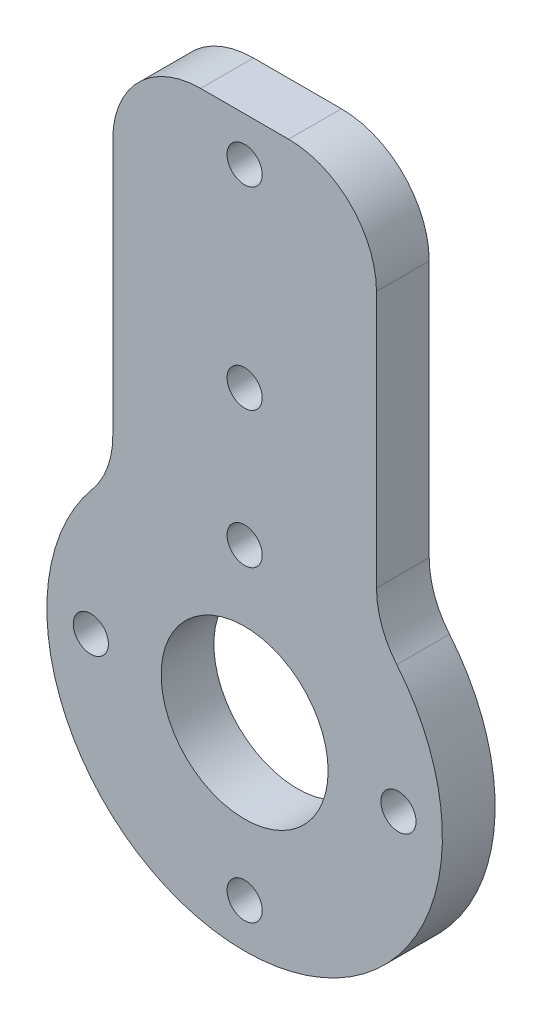
ISO-10303-21;
HEADER;
FILE_DESCRIPTION(('STEP AP214'),'2;1');
FILE_NAME('part.step','',(''),(''),'','','');
FILE_SCHEMA(('AUTOMOTIVE_DESIGN { 1 0 10303 214 1 1 1 1 }'));
ENDSEC;
DATA;
#1=APPLICATION_CONTEXT('core data for automotive mechanical design processes');
#2=APPLICATION_PROTOCOL_DEFINITION('international standard','automotive_design',2000,#1);
#3=PRODUCT_CONTEXT('',#1,'mechanical');
#4=PRODUCT('Part','Part','',(#3));
#5=PRODUCT_RELATED_PRODUCT_CATEGORY('part','',(#4));
#6=PRODUCT_DEFINITION_FORMATION('','',#4);
#7=PRODUCT_DEFINITION_CONTEXT('part definition',#1,'design');
#8=PRODUCT_DEFINITION('design','',#6,#7);
#9=PRODUCT_DEFINITION_SHAPE('','',#8);
#10=(LENGTH_UNIT() NAMED_UNIT(*) SI_UNIT(.MILLI.,.METRE.));
#11=(NAMED_UNIT(*) PLANE_ANGLE_UNIT() SI_UNIT($,.RADIAN.));
#12=(NAMED_UNIT(*) SI_UNIT($,.STERADIAN.) SOLID_ANGLE_UNIT());
#13=UNCERTAINTY_MEASURE_WITH_UNIT(LENGTH_MEASURE(1.E-05),#10,'distance_accuracy_value','');
#14=(GEOMETRIC_REPRESENTATION_CONTEXT(3) GLOBAL_UNCERTAINTY_ASSIGNED_CONTEXT((#13)) GLOBAL_UNIT_ASSIGNED_CONTEXT((#10,
#11,#12)) REPRESENTATION_CONTEXT('',''));
#15=CARTESIAN_POINT('',(0.,0.,0.));
#16=DIRECTION('',(0.,0.,1.));
#17=DIRECTION('',(1.,0.,0.));
#18=AXIS2_PLACEMENT_3D('',#15,#16,#17);
#19=CARTESIAN_POINT('',(-15.,0.,3.));
#20=DIRECTION('',(1.,0.,0.));
#21=DIRECTION('',(0.,1.,0.));
#22=AXIS2_PLACEMENT_3D('',#19,#20,#21);
#23=PLANE('',#22);
#24=DIRECTION('',(0.,-1.,0.));
#25=VECTOR('',#24,1.);
#26=CARTESIAN_POINT('',(-15.,0.,3.));
#27=LINE('',#26,#25);
#28=CARTESIAN_POINT('',(-15.,50.,3.));
#29=VERTEX_POINT('',#28);
#30=CARTESIAN_POINT('',(-15.,20.7665596572952,3.));
#31=VERTEX_POINT('',#30);
#32=EDGE_CURVE('E199',#29,#31,#27,.T.);
#33=ORIENTED_EDGE('',*,*,#32,.F.);
#34=DIRECTION('',(0.,0.,-1.));
#35=VECTOR('',#34,1.);
#36=CARTESIAN_POINT('',(-15.,50.,-3.));
#37=LINE('',#36,#35);
#38=CARTESIAN_POINT('',(-15.,50.,-3.));
#39=VERTEX_POINT('',#38);
#40=EDGE_CURVE('E169',#29,#39,#37,.T.);
#41=ORIENTED_EDGE('',*,*,#40,.T.);
#42=DIRECTION('',(0.,-1.,0.));
#43=VECTOR('',#42,1.);
#44=CARTESIAN_POINT('',(-15.,0.,-3.));
#45=LINE('',#44,#43);
#46=CARTESIAN_POINT('',(-15.,20.7665596572952,-3.));
#47=VERTEX_POINT('',#46);
#48=EDGE_CURVE('E116',#39,#47,#45,.T.);
#49=ORIENTED_EDGE('',*,*,#48,.T.);
#50=DIRECTION('',(0.,0.,1.));
#51=VECTOR('',#50,1.);
#52=CARTESIAN_POINT('',(-15.,20.7665596572952,3.));
#53=LINE('',#52,#51);
#54=EDGE_CURVE('E166',#47,#31,#53,.T.);
#55=ORIENTED_EDGE('',*,*,#54,.T.);
#56=EDGE_LOOP('',(#33,#41,#49,#55));
#57=FACE_BOUND('',#56,.T.);
#58=ADVANCED_FACE('F44',(#57),#23,.F.);
#59=CARTESIAN_POINT('',(0.,0.,3.));
#60=DIRECTION('',(0.,0.,-1.));
#61=DIRECTION('',(-1.,0.,0.));
#62=AXIS2_PLACEMENT_3D('',#59,#60,#61);
#63=CYLINDRICAL_SURFACE('',#62,22.5);
#64=CARTESIAN_POINT('',(0.,0.,-3.));
#65=DIRECTION('',(0.,0.,1.));
#66=DIRECTION('',(1.,0.,0.));
#67=AXIS2_PLACEMENT_3D('',#64,#65,#66);
#68=CIRCLE('',#67,22.5);
#69=CARTESIAN_POINT('',(-17.3076923076923,14.3768489935121,-3.));
#70=VERTEX_POINT('',#69);
#71=CARTESIAN_POINT('',(17.3076923076923,14.3768489935121,-3.));
#72=VERTEX_POINT('',#71);
#73=EDGE_CURVE('E185',#70,#72,#68,.T.);
#74=ORIENTED_EDGE('',*,*,#73,.T.);
#75=DIRECTION('',(0.,0.,-1.));
#76=VECTOR('',#75,1.);
#77=CARTESIAN_POINT('',(17.3076923076923,14.3768489935121,3.));
#78=LINE('',#77,#76);
#79=CARTESIAN_POINT('',(17.3076923076923,14.3768489935121,3.));
#80=VERTEX_POINT('',#79);
#81=EDGE_CURVE('E60',#72,#80,#78,.F.);
#82=ORIENTED_EDGE('',*,*,#81,.T.);
#83=CARTESIAN_POINT('',(0.,0.,3.));
#84=DIRECTION('',(0.,0.,1.));
#85=DIRECTION('',(1.,0.,0.));
#86=AXIS2_PLACEMENT_3D('',#83,#84,#85);
#87=CIRCLE('',#86,22.5);
#88=CARTESIAN_POINT('',(-17.3076923076923,14.3768489935121,3.));
#89=VERTEX_POINT('',#88);
#90=EDGE_CURVE('E195',#89,#80,#87,.T.);
#91=ORIENTED_EDGE('',*,*,#90,.F.);
#92=DIRECTION('',(0.,0.,-1.));
#93=VECTOR('',#92,1.);
#94=CARTESIAN_POINT('',(-17.3076923076923,14.3768489935121,3.));
#95=LINE('',#94,#93);
#96=EDGE_CURVE('E172',#89,#70,#95,.T.);
#97=ORIENTED_EDGE('',*,*,#96,.T.);
#98=EDGE_LOOP('',(#74,#82,#91,#97));
#99=FACE_BOUND('',#98,.T.);
#100=ADVANCED_FACE('F194',(#99),#63,.T.);
#101=CARTESIAN_POINT('',(15.,0.,3.));
#102=DIRECTION('',(1.,0.,0.));
#103=DIRECTION('',(0.,1.,0.));
#104=AXIS2_PLACEMENT_3D('',#101,#102,#103);
#105=PLANE('',#104);
#106=DIRECTION('',(0.,-1.,0.));
#107=VECTOR('',#106,1.);
#108=CARTESIAN_POINT('',(15.,0.,-3.));
#109=LINE('',#108,#107);
#110=CARTESIAN_POINT('',(15.,50.,-3.));
#111=VERTEX_POINT('',#110);
#112=CARTESIAN_POINT('',(15.,20.7665596572952,-3.));
#113=VERTEX_POINT('',#112);
#114=EDGE_CURVE('E134',#111,#113,#109,.T.);
#115=ORIENTED_EDGE('',*,*,#114,.F.);
#116=DIRECTION('',(0.,0.,-1.));
#117=VECTOR('',#116,1.);
#118=CARTESIAN_POINT('',(15.,50.,3.));
#119=LINE('',#118,#117);
#120=CARTESIAN_POINT('',(15.,50.,3.));
#121=VERTEX_POINT('',#120);
#122=EDGE_CURVE('E158',#111,#121,#119,.F.);
#123=ORIENTED_EDGE('',*,*,#122,.T.);
#124=DIRECTION('',(0.,-1.,0.));
#125=VECTOR('',#124,1.);
#126=CARTESIAN_POINT('',(15.,0.,3.));
#127=LINE('',#126,#125);
#128=CARTESIAN_POINT('',(15.,20.7665596572952,3.));
#129=VERTEX_POINT('',#128);
#130=EDGE_CURVE('E198',#121,#129,#127,.T.);
#131=ORIENTED_EDGE('',*,*,#130,.T.);
#132=DIRECTION('',(0.,0.,-1.));
#133=VECTOR('',#132,1.);
#134=CARTESIAN_POINT('',(15.,20.7665596572952,3.));
#135=LINE('',#134,#133);
#136=EDGE_CURVE('E154',#129,#113,#135,.T.);
#137=ORIENTED_EDGE('',*,*,#136,.T.);
#138=EDGE_LOOP('',(#115,#123,#131,#137));
#139=FACE_BOUND('',#138,.T.);
#140=ADVANCED_FACE('F304',(#139),#105,.T.);
#141=CARTESIAN_POINT('',(0.,17.5,3.));
#142=DIRECTION('',(0.,0.,-1.));
#143=DIRECTION('',(-1.,0.,0.));
#144=AXIS2_PLACEMENT_3D('',#141,#142,#143);
#145=CYLINDRICAL_SURFACE('',#144,2.);
#146=CARTESIAN_POINT('',(0.,17.5,3.));
#147=DIRECTION('',(0.,0.,1.));
#148=DIRECTION('',(1.,0.,0.));
#149=AXIS2_PLACEMENT_3D('',#146,#147,#148);
#150=CIRCLE('',#149,2.);
#151=CARTESIAN_POINT('',(2.,17.5,3.));
#152=VERTEX_POINT('',#151);
#153=EDGE_CURVE('E146',#152,#152,#150,.T.);
#154=ORIENTED_EDGE('',*,*,#153,.T.);
#155=EDGE_LOOP('',(#154));
#156=FACE_BOUND('',#155,.T.);
#157=CARTESIAN_POINT('',(0.,17.5,-3.));
#158=DIRECTION('',(0.,0.,1.));
#159=DIRECTION('',(1.,0.,0.));
#160=AXIS2_PLACEMENT_3D('',#157,#158,#159);
#161=CIRCLE('',#160,2.);
#162=CARTESIAN_POINT('',(2.,17.5,-3.));
#163=VERTEX_POINT('',#162);
#164=EDGE_CURVE('E249',#163,#163,#161,.T.);
#165=ORIENTED_EDGE('',*,*,#164,.F.);
#166=EDGE_LOOP('',(#165));
#167=FACE_BOUND('',#166,.T.);
#168=ADVANCED_FACE('F326',(#156,#167),#145,.F.);
#169=CARTESIAN_POINT('',(17.5,0.,3.));
#170=DIRECTION('',(0.,0.,-1.));
#171=DIRECTION('',(-1.,0.,0.));
#172=AXIS2_PLACEMENT_3D('',#169,#170,#171);
#173=CYLINDRICAL_SURFACE('',#172,2.);
#174=CARTESIAN_POINT('',(17.5,0.,3.));
#175=DIRECTION('',(0.,0.,1.));
#176=DIRECTION('',(1.,0.,0.));
#177=AXIS2_PLACEMENT_3D('',#174,#175,#176);
#178=CIRCLE('',#177,2.);
#179=CARTESIAN_POINT('',(19.5,0.,3.));
#180=VERTEX_POINT('',#179);
#181=EDGE_CURVE('E220',#180,#180,#178,.T.);
#182=ORIENTED_EDGE('',*,*,#181,.T.);
#183=EDGE_LOOP('',(#182));
#184=FACE_BOUND('',#183,.T.);
#185=CARTESIAN_POINT('',(17.5,0.,-3.));
#186=DIRECTION('',(0.,0.,1.));
#187=DIRECTION('',(1.,0.,0.));
#188=AXIS2_PLACEMENT_3D('',#185,#186,#187);
#189=CIRCLE('',#188,2.);
#190=CARTESIAN_POINT('',(19.5,0.,-3.));
#191=VERTEX_POINT('',#190);
#192=EDGE_CURVE('E246',#191,#191,#189,.T.);
#193=ORIENTED_EDGE('',*,*,#192,.F.);
#194=EDGE_LOOP('',(#193));
#195=FACE_BOUND('',#194,.T.);
#196=ADVANCED_FACE('F330',(#184,#195),#173,.F.);
#197=CARTESIAN_POINT('',(0.,-17.5,3.));
#198=DIRECTION('',(0.,0.,-1.));
#199=DIRECTION('',(-1.,0.,0.));
#200=AXIS2_PLACEMENT_3D('',#197,#198,#199);
#201=CYLINDRICAL_SURFACE('',#200,2.);
#202=CARTESIAN_POINT('',(0.,-17.5,3.));
#203=DIRECTION('',(0.,0.,1.));
#204=DIRECTION('',(1.,0.,0.));
#205=AXIS2_PLACEMENT_3D('',#202,#203,#204);
#206=CIRCLE('',#205,2.);
#207=CARTESIAN_POINT('',(2.,-17.5,3.));
#208=VERTEX_POINT('',#207);
#209=EDGE_CURVE('E216',#208,#208,#206,.T.);
#210=ORIENTED_EDGE('',*,*,#209,.T.);
#211=EDGE_LOOP('',(#210));
#212=FACE_BOUND('',#211,.T.);
#213=CARTESIAN_POINT('',(0.,-17.5,-3.));
#214=DIRECTION('',(0.,0.,1.));
#215=DIRECTION('',(1.,0.,0.));
#216=AXIS2_PLACEMENT_3D('',#213,#214,#215);
#217=CIRCLE('',#216,2.);
#218=CARTESIAN_POINT('',(2.,-17.5,-3.));
#219=VERTEX_POINT('',#218);
#220=EDGE_CURVE('E242',#219,#219,#217,.T.);
#221=ORIENTED_EDGE('',*,*,#220,.F.);
#222=EDGE_LOOP('',(#221));
#223=FACE_BOUND('',#222,.T.);
#224=ADVANCED_FACE('F338',(#212,#223),#201,.F.);
#225=CARTESIAN_POINT('',(-17.5,0.,3.));
#226=DIRECTION('',(0.,0.,-1.));
#227=DIRECTION('',(-1.,0.,0.));
#228=AXIS2_PLACEMENT_3D('',#225,#226,#227);
#229=CYLINDRICAL_SURFACE('',#228,2.);
#230=CARTESIAN_POINT('',(-17.5,0.,3.));
#231=DIRECTION('',(0.,0.,1.));
#232=DIRECTION('',(1.,0.,0.));
#233=AXIS2_PLACEMENT_3D('',#230,#231,#232);
#234=CIRCLE('',#233,2.);
#235=CARTESIAN_POINT('',(-15.5,0.,3.));
#236=VERTEX_POINT('',#235);
#237=EDGE_CURVE('E212',#236,#236,#234,.T.);
#238=ORIENTED_EDGE('',*,*,#237,.T.);
#239=EDGE_LOOP('',(#238));
#240=FACE_BOUND('',#239,.T.);
#241=CARTESIAN_POINT('',(-17.5,0.,-3.));
#242=DIRECTION('',(0.,0.,1.));
#243=DIRECTION('',(1.,0.,0.));
#244=AXIS2_PLACEMENT_3D('',#241,#242,#243);
#245=CIRCLE('',#244,2.);
#246=CARTESIAN_POINT('',(-15.5,0.,-3.));
#247=VERTEX_POINT('',#246);
#248=EDGE_CURVE('E133',#247,#247,#245,.T.);
#249=ORIENTED_EDGE('',*,*,#248,.F.);
#250=EDGE_LOOP('',(#249));
#251=FACE_BOUND('',#250,.T.);
#252=ADVANCED_FACE('F335',(#240,#251),#229,.F.);
#253=CARTESIAN_POINT('',(0.,60.,3.));
#254=DIRECTION('',(0.,1.,0.));
#255=DIRECTION('',(0.,0.,1.));
#256=AXIS2_PLACEMENT_3D('',#253,#254,#255);
#257=PLANE('',#256);
#258=DIRECTION('',(1.,0.,0.));
#259=VECTOR('',#258,1.);
#260=CARTESIAN_POINT('',(0.,60.,3.));
#261=LINE('',#260,#259);
#262=CARTESIAN_POINT('',(-5.,60.,3.));
#263=VERTEX_POINT('',#262);
#264=CARTESIAN_POINT('',(5.,60.,3.));
#265=VERTEX_POINT('',#264);
#266=EDGE_CURVE('E204',#263,#265,#261,.T.);
#267=ORIENTED_EDGE('',*,*,#266,.T.);
#268=DIRECTION('',(0.,0.,-1.));
#269=VECTOR('',#268,1.);
#270=CARTESIAN_POINT('',(5.,60.,3.));
#271=LINE('',#270,#269);
#272=CARTESIAN_POINT('',(5.,60.,-3.));
#273=VERTEX_POINT('',#272);
#274=EDGE_CURVE('E123',#265,#273,#271,.T.);
#275=ORIENTED_EDGE('',*,*,#274,.T.);
#276=DIRECTION('',(1.,0.,0.));
#277=VECTOR('',#276,1.);
#278=CARTESIAN_POINT('',(0.,60.,-3.));
#279=LINE('',#278,#277);
#280=CARTESIAN_POINT('',(-5.,60.,-3.));
#281=VERTEX_POINT('',#280);
#282=EDGE_CURVE('E114',#281,#273,#279,.T.);
#283=ORIENTED_EDGE('',*,*,#282,.F.);
#284=DIRECTION('',(0.,0.,-1.));
#285=VECTOR('',#284,1.);
#286=CARTESIAN_POINT('',(-5.,60.,3.));
#287=LINE('',#286,#285);
#288=EDGE_CURVE('E129',#281,#263,#287,.F.);
#289=ORIENTED_EDGE('',*,*,#288,.T.);
#290=EDGE_LOOP('',(#267,#275,#283,#289));
#291=FACE_BOUND('',#290,.T.);
#292=ADVANCED_FACE('F128',(#291),#257,.T.);
#293=CARTESIAN_POINT('',(0.,55.,3.));
#294=DIRECTION('',(0.,0.,-1.));
#295=DIRECTION('',(-1.,0.,0.));
#296=AXIS2_PLACEMENT_3D('',#293,#294,#295);
#297=CYLINDRICAL_SURFACE('',#296,2.);
#298=CARTESIAN_POINT('',(0.,55.,3.));
#299=DIRECTION('',(0.,0.,1.));
#300=DIRECTION('',(1.,0.,0.));
#301=AXIS2_PLACEMENT_3D('',#298,#299,#300);
#302=CIRCLE('',#301,2.);
#303=CARTESIAN_POINT('',(2.,55.,3.));
#304=VERTEX_POINT('',#303);
#305=EDGE_CURVE('E206',#304,#304,#302,.T.);
#306=ORIENTED_EDGE('',*,*,#305,.T.);
#307=EDGE_LOOP('',(#306));
#308=FACE_BOUND('',#307,.T.);
#309=CARTESIAN_POINT('',(0.,55.,-3.));
#310=DIRECTION('',(0.,0.,1.));
#311=DIRECTION('',(1.,0.,0.));
#312=AXIS2_PLACEMENT_3D('',#309,#310,#311);
#313=CIRCLE('',#312,2.);
#314=CARTESIAN_POINT('',(2.,55.,-3.));
#315=VERTEX_POINT('',#314);
#316=EDGE_CURVE('E192',#315,#315,#313,.T.);
#317=ORIENTED_EDGE('',*,*,#316,.F.);
#318=EDGE_LOOP('',(#317));
#319=FACE_BOUND('',#318,.T.);
#320=ADVANCED_FACE('F268',(#308,#319),#297,.F.);
#321=CARTESIAN_POINT('',(0.,33.,3.));
#322=DIRECTION('',(0.,0.,-1.));
#323=DIRECTION('',(-1.,0.,0.));
#324=AXIS2_PLACEMENT_3D('',#321,#322,#323);
#325=CYLINDRICAL_SURFACE('',#324,2.);
#326=CARTESIAN_POINT('',(0.,33.,3.));
#327=DIRECTION('',(0.,0.,1.));
#328=DIRECTION('',(1.,0.,0.));
#329=AXIS2_PLACEMENT_3D('',#326,#327,#328);
#330=CIRCLE('',#329,2.);
#331=CARTESIAN_POINT('',(2.,33.,3.));
#332=VERTEX_POINT('',#331);
#333=EDGE_CURVE('E256',#332,#332,#330,.T.);
#334=ORIENTED_EDGE('',*,*,#333,.T.);
#335=EDGE_LOOP('',(#334));
#336=FACE_BOUND('',#335,.T.);
#337=CARTESIAN_POINT('',(0.,33.,-3.));
#338=DIRECTION('',(0.,0.,1.));
#339=DIRECTION('',(1.,0.,0.));
#340=AXIS2_PLACEMENT_3D('',#337,#338,#339);
#341=CIRCLE('',#340,2.);
#342=CARTESIAN_POINT('',(2.,33.,-3.));
#343=VERTEX_POINT('',#342);
#344=EDGE_CURVE('E227',#343,#343,#341,.T.);
#345=ORIENTED_EDGE('',*,*,#344,.F.);
#346=EDGE_LOOP('',(#345));
#347=FACE_BOUND('',#346,.T.);
#348=ADVANCED_FACE('F291',(#336,#347),#325,.F.);
#349=CARTESIAN_POINT('',(0.,0.,3.));
#350=DIRECTION('',(0.,0.,-1.));
#351=DIRECTION('',(-1.,0.,0.));
#352=AXIS2_PLACEMENT_3D('',#349,#350,#351);
#353=CYLINDRICAL_SURFACE('',#352,9.5);
#354=CARTESIAN_POINT('',(0.,0.,3.));
#355=DIRECTION('',(0.,0.,1.));
#356=DIRECTION('',(1.,0.,0.));
#357=AXIS2_PLACEMENT_3D('',#354,#355,#356);
#358=CIRCLE('',#357,9.5);
#359=CARTESIAN_POINT('',(9.5,0.,3.));
#360=VERTEX_POINT('',#359);
#361=EDGE_CURVE('E140',#360,#360,#358,.T.);
#362=ORIENTED_EDGE('',*,*,#361,.T.);
#363=EDGE_LOOP('',(#362));
#364=FACE_BOUND('',#363,.T.);
#365=CARTESIAN_POINT('',(0.,0.,-3.));
#366=DIRECTION('',(0.,0.,1.));
#367=DIRECTION('',(1.,0.,0.));
#368=AXIS2_PLACEMENT_3D('',#365,#366,#367);
#369=CIRCLE('',#368,9.5);
#370=CARTESIAN_POINT('',(9.5,0.,-3.));
#371=VERTEX_POINT('',#370);
#372=EDGE_CURVE('E149',#371,#371,#369,.T.);
#373=ORIENTED_EDGE('',*,*,#372,.F.);
#374=EDGE_LOOP('',(#373));
#375=FACE_BOUND('',#374,.T.);
#376=ADVANCED_FACE('F273',(#364,#375),#353,.F.);
#377=CARTESIAN_POINT('',(0.,0.,3.));
#378=DIRECTION('',(0.,0.,1.));
#379=DIRECTION('',(1.,0.,0.));
#380=AXIS2_PLACEMENT_3D('',#377,#378,#379);
#381=PLANE('',#380);
#382=ORIENTED_EDGE('',*,*,#333,.F.);
#383=EDGE_LOOP('',(#382));
#384=FACE_BOUND('',#383,.T.);
#385=ORIENTED_EDGE('',*,*,#305,.F.);
#386=EDGE_LOOP('',(#385));
#387=FACE_BOUND('',#386,.T.);
#388=ORIENTED_EDGE('',*,*,#130,.F.);
#389=CARTESIAN_POINT('',(5.,50.,3.));
#390=DIRECTION('',(0.,0.,1.));
#391=DIRECTION('',(1.,0.,0.));
#392=AXIS2_PLACEMENT_3D('',#389,#390,#391);
#393=CIRCLE('',#392,10.);
#394=EDGE_CURVE('E163',#121,#265,#393,.T.);
#395=ORIENTED_EDGE('',*,*,#394,.T.);
#396=ORIENTED_EDGE('',*,*,#266,.F.);
#397=CARTESIAN_POINT('',(-5.,50.,3.));
#398=DIRECTION('',(0.,0.,1.));
#399=DIRECTION('',(1.,0.,0.));
#400=AXIS2_PLACEMENT_3D('',#397,#398,#399);
#401=CIRCLE('',#400,10.);
#402=EDGE_CURVE('E138',#263,#29,#401,.T.);
#403=ORIENTED_EDGE('',*,*,#402,.T.);
#404=ORIENTED_EDGE('',*,*,#32,.T.);
#405=CARTESIAN_POINT('',(-25.,20.7665596572952,3.));
#406=DIRECTION('',(0.,0.,1.));
#407=DIRECTION('',(1.,0.,0.));
#408=AXIS2_PLACEMENT_3D('',#405,#406,#407);
#409=CIRCLE('',#408,10.);
#410=EDGE_CURVE('E11',#31,#89,#409,.F.);
#411=ORIENTED_EDGE('',*,*,#410,.T.);
#412=ORIENTED_EDGE('',*,*,#90,.T.);
#413=CARTESIAN_POINT('',(25.,20.7665596572952,3.));
#414=DIRECTION('',(0.,0.,1.));
#415=DIRECTION('',(1.,0.,0.));
#416=AXIS2_PLACEMENT_3D('',#413,#414,#415);
#417=CIRCLE('',#416,10.);
#418=EDGE_CURVE('E181',#80,#129,#417,.F.);
#419=ORIENTED_EDGE('',*,*,#418,.T.);
#420=EDGE_LOOP('',(#388,#395,#396,#403,#404,#411,#412,#419));
#421=FACE_BOUND('',#420,.T.);
#422=ORIENTED_EDGE('',*,*,#237,.F.);
#423=EDGE_LOOP('',(#422));
#424=FACE_BOUND('',#423,.T.);
#425=ORIENTED_EDGE('',*,*,#209,.F.);
#426=EDGE_LOOP('',(#425));
#427=FACE_BOUND('',#426,.T.);
#428=ORIENTED_EDGE('',*,*,#181,.F.);
#429=EDGE_LOOP('',(#428));
#430=FACE_BOUND('',#429,.T.);
#431=ORIENTED_EDGE('',*,*,#153,.F.);
#432=EDGE_LOOP('',(#431));
#433=FACE_BOUND('',#432,.T.);
#434=ORIENTED_EDGE('',*,*,#361,.F.);
#435=EDGE_LOOP('',(#434));
#436=FACE_BOUND('',#435,.T.);
#437=ADVANCED_FACE('F271',(#384,#387,#421,#424,#427,#430,#433,#436),#381,.T.);
#438=CARTESIAN_POINT('',(0.,0.,-3.));
#439=DIRECTION('',(0.,0.,1.));
#440=DIRECTION('',(1.,0.,0.));
#441=AXIS2_PLACEMENT_3D('',#438,#439,#440);
#442=PLANE('',#441);
#443=ORIENTED_EDGE('',*,*,#344,.T.);
#444=EDGE_LOOP('',(#443));
#445=FACE_BOUND('',#444,.T.);
#446=ORIENTED_EDGE('',*,*,#316,.T.);
#447=EDGE_LOOP('',(#446));
#448=FACE_BOUND('',#447,.T.);
#449=ORIENTED_EDGE('',*,*,#282,.T.);
#450=CARTESIAN_POINT('',(5.,50.,-3.));
#451=DIRECTION('',(0.,0.,1.));
#452=DIRECTION('',(1.,0.,0.));
#453=AXIS2_PLACEMENT_3D('',#450,#451,#452);
#454=CIRCLE('',#453,10.);
#455=EDGE_CURVE('E122',#273,#111,#454,.F.);
#456=ORIENTED_EDGE('',*,*,#455,.T.);
#457=ORIENTED_EDGE('',*,*,#114,.T.);
#458=CARTESIAN_POINT('',(25.,20.7665596572952,-3.));
#459=DIRECTION('',(0.,0.,1.));
#460=DIRECTION('',(1.,0.,0.));
#461=AXIS2_PLACEMENT_3D('',#458,#459,#460);
#462=CIRCLE('',#461,10.);
#463=EDGE_CURVE('E178',#113,#72,#462,.T.);
#464=ORIENTED_EDGE('',*,*,#463,.T.);
#465=ORIENTED_EDGE('',*,*,#73,.F.);
#466=CARTESIAN_POINT('',(-25.,20.7665596572952,-3.));
#467=DIRECTION('',(0.,0.,1.));
#468=DIRECTION('',(1.,0.,0.));
#469=AXIS2_PLACEMENT_3D('',#466,#467,#468);
#470=CIRCLE('',#469,10.);
#471=EDGE_CURVE('E53',#70,#47,#470,.T.);
#472=ORIENTED_EDGE('',*,*,#471,.T.);
#473=ORIENTED_EDGE('',*,*,#48,.F.);
#474=CARTESIAN_POINT('',(-5.,50.,-3.));
#475=DIRECTION('',(0.,0.,1.));
#476=DIRECTION('',(1.,0.,0.));
#477=AXIS2_PLACEMENT_3D('',#474,#475,#476);
#478=CIRCLE('',#477,10.);
#479=EDGE_CURVE('E110',#39,#281,#478,.F.);
#480=ORIENTED_EDGE('',*,*,#479,.T.);
#481=EDGE_LOOP('',(#449,#456,#457,#464,#465,#472,#473,#480));
#482=FACE_BOUND('',#481,.T.);
#483=ORIENTED_EDGE('',*,*,#248,.T.);
#484=EDGE_LOOP('',(#483));
#485=FACE_BOUND('',#484,.T.);
#486=ORIENTED_EDGE('',*,*,#220,.T.);
#487=EDGE_LOOP('',(#486));
#488=FACE_BOUND('',#487,.T.);
#489=ORIENTED_EDGE('',*,*,#192,.T.);
#490=EDGE_LOOP('',(#489));
#491=FACE_BOUND('',#490,.T.);
#492=ORIENTED_EDGE('',*,*,#164,.T.);
#493=EDGE_LOOP('',(#492));
#494=FACE_BOUND('',#493,.T.);
#495=ORIENTED_EDGE('',*,*,#372,.T.);
#496=EDGE_LOOP('',(#495));
#497=FACE_BOUND('',#496,.T.);
#498=ADVANCED_FACE('F112',(#445,#448,#482,#485,#488,#491,#494,#497),#442,.F.);
#499=CARTESIAN_POINT('',(5.,50.,3.));
#500=DIRECTION('',(0.,0.,-1.));
#501=DIRECTION('',(-1.,0.,0.));
#502=AXIS2_PLACEMENT_3D('',#499,#500,#501);
#503=CYLINDRICAL_SURFACE('',#502,10.);
#504=ORIENTED_EDGE('',*,*,#394,.F.);
#505=ORIENTED_EDGE('',*,*,#122,.F.);
#506=ORIENTED_EDGE('',*,*,#455,.F.);
#507=ORIENTED_EDGE('',*,*,#274,.F.);
#508=EDGE_LOOP('',(#504,#505,#506,#507));
#509=FACE_BOUND('',#508,.T.);
#510=ADVANCED_FACE('F310',(#509),#503,.T.);
#511=CARTESIAN_POINT('',(-5.,50.,3.));
#512=DIRECTION('',(0.,0.,1.));
#513=DIRECTION('',(1.,0.,0.));
#514=AXIS2_PLACEMENT_3D('',#511,#512,#513);
#515=CYLINDRICAL_SURFACE('',#514,10.);
#516=ORIENTED_EDGE('',*,*,#402,.F.);
#517=ORIENTED_EDGE('',*,*,#288,.F.);
#518=ORIENTED_EDGE('',*,*,#479,.F.);
#519=ORIENTED_EDGE('',*,*,#40,.F.);
#520=EDGE_LOOP('',(#516,#517,#518,#519));
#521=FACE_BOUND('',#520,.T.);
#522=ADVANCED_FACE('F137',(#521),#515,.T.);
#523=CARTESIAN_POINT('',(25.,20.7665596572952,3.));
#524=DIRECTION('',(0.,0.,-1.));
#525=DIRECTION('',(-1.,0.,0.));
#526=AXIS2_PLACEMENT_3D('',#523,#524,#525);
#527=CYLINDRICAL_SURFACE('',#526,10.);
#528=ORIENTED_EDGE('',*,*,#418,.F.);
#529=ORIENTED_EDGE('',*,*,#81,.F.);
#530=ORIENTED_EDGE('',*,*,#463,.F.);
#531=ORIENTED_EDGE('',*,*,#136,.F.);
#532=EDGE_LOOP('',(#528,#529,#530,#531));
#533=FACE_BOUND('',#532,.T.);
#534=ADVANCED_FACE('F315',(#533),#527,.F.);
#535=CARTESIAN_POINT('',(-25.,20.7665596572952,3.));
#536=DIRECTION('',(0.,0.,-1.));
#537=DIRECTION('',(-1.,0.,0.));
#538=AXIS2_PLACEMENT_3D('',#535,#536,#537);
#539=CYLINDRICAL_SURFACE('',#538,10.);
#540=ORIENTED_EDGE('',*,*,#410,.F.);
#541=ORIENTED_EDGE('',*,*,#54,.F.);
#542=ORIENTED_EDGE('',*,*,#471,.F.);
#543=ORIENTED_EDGE('',*,*,#96,.F.);
#544=EDGE_LOOP('',(#540,#541,#542,#543));
#545=FACE_BOUND('',#544,.T.);
#546=ADVANCED_FACE('F46',(#545),#539,.F.);
#547=CLOSED_SHELL('',(#58,#100,#140,#168,#196,#224,#252,#292,#320,#348,#376,#437,#498,#510,#522,
#534,#546));
#548=MANIFOLD_SOLID_BREP('B2',#547);
#549=ADVANCED_BREP_SHAPE_REPRESENTATION('',(#18,#548),#14);
#550=SHAPE_DEFINITION_REPRESENTATION(#9,#549);
ENDSEC;
END-ISO-10303-21;
